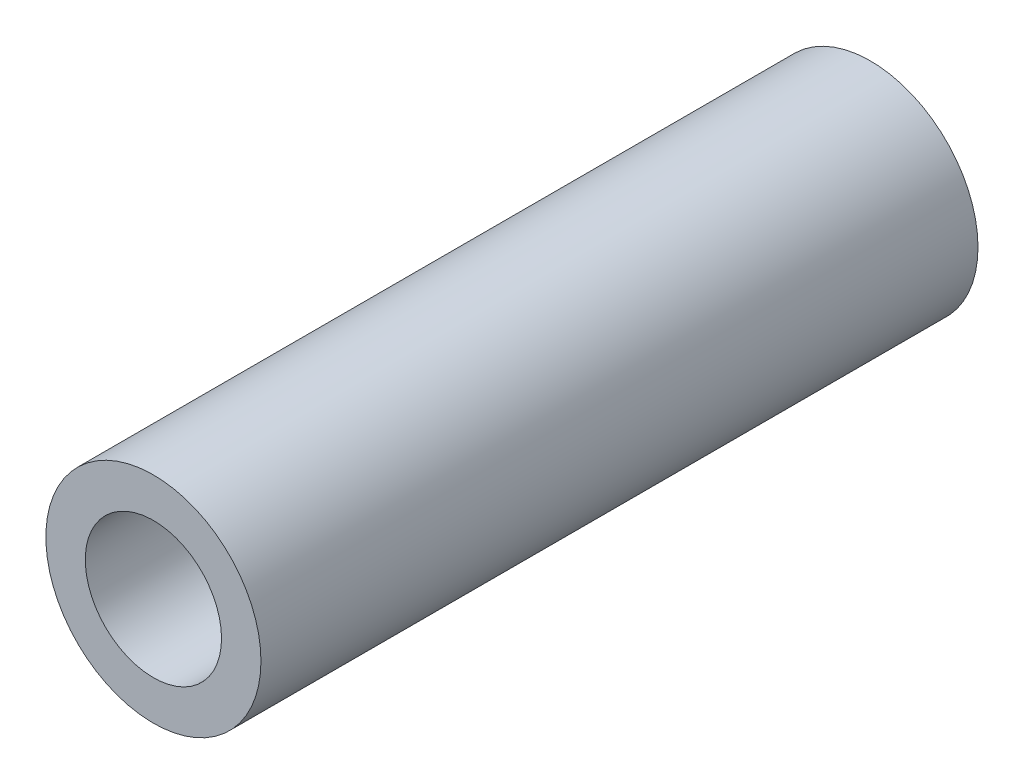
ISO-10303-21;
HEADER;
FILE_DESCRIPTION(('STEP AP214'),'2;1');
FILE_NAME('part.step','',(''),(''),'','','');
FILE_SCHEMA(('AUTOMOTIVE_DESIGN { 1 0 10303 214 1 1 1 1 }'));
ENDSEC;
DATA;
#1=APPLICATION_CONTEXT('core data for automotive mechanical design processes');
#2=APPLICATION_PROTOCOL_DEFINITION('international standard','automotive_design',2000,#1);
#3=PRODUCT_CONTEXT('',#1,'mechanical');
#4=PRODUCT('Part','Part','',(#3));
#5=PRODUCT_RELATED_PRODUCT_CATEGORY('part','',(#4));
#6=PRODUCT_DEFINITION_FORMATION('','',#4);
#7=PRODUCT_DEFINITION_CONTEXT('part definition',#1,'design');
#8=PRODUCT_DEFINITION('design','',#6,#7);
#9=PRODUCT_DEFINITION_SHAPE('','',#8);
#10=(LENGTH_UNIT() NAMED_UNIT(*) SI_UNIT(.MILLI.,.METRE.));
#11=(NAMED_UNIT(*) PLANE_ANGLE_UNIT() SI_UNIT($,.RADIAN.));
#12=(NAMED_UNIT(*) SI_UNIT($,.STERADIAN.) SOLID_ANGLE_UNIT());
#13=UNCERTAINTY_MEASURE_WITH_UNIT(LENGTH_MEASURE(1.E-05),#10,'distance_accuracy_value','');
#14=(GEOMETRIC_REPRESENTATION_CONTEXT(3) GLOBAL_UNCERTAINTY_ASSIGNED_CONTEXT((#13)) GLOBAL_UNIT_ASSIGNED_CONTEXT((#10,
#11,#12)) REPRESENTATION_CONTEXT('',''));
#15=CARTESIAN_POINT('',(0.,0.,0.));
#16=DIRECTION('',(0.,0.,1.));
#17=DIRECTION('',(1.,0.,0.));
#18=AXIS2_PLACEMENT_3D('',#15,#16,#17);
#19=CARTESIAN_POINT('',(0.,0.,50.8));
#20=DIRECTION('',(0.,0.,1.));
#21=DIRECTION('',(1.,0.,0.));
#22=AXIS2_PLACEMENT_3D('',#19,#20,#21);
#23=PLANE('',#22);
#24=CARTESIAN_POINT('',(0.,0.,50.8));
#25=DIRECTION('',(0.,0.,1.));
#26=DIRECTION('',(1.,0.,0.));
#27=AXIS2_PLACEMENT_3D('',#24,#25,#26);
#28=CIRCLE('',#27,7.62);
#29=CARTESIAN_POINT('',(7.62,0.,50.8));
#30=VERTEX_POINT('',#29);
#31=EDGE_CURVE('E10',#30,#30,#28,.T.);
#32=ORIENTED_EDGE('',*,*,#31,.T.);
#33=EDGE_LOOP('',(#32));
#34=FACE_BOUND('',#33,.T.);
#35=CARTESIAN_POINT('',(0.,0.,50.8));
#36=DIRECTION('',(0.,0.,1.));
#37=DIRECTION('',(1.,0.,0.));
#38=AXIS2_PLACEMENT_3D('',#35,#36,#37);
#39=CIRCLE('',#38,4.826);
#40=CARTESIAN_POINT('',(4.826,0.,50.8));
#41=VERTEX_POINT('',#40);
#42=EDGE_CURVE('E42',#41,#41,#39,.T.);
#43=ORIENTED_EDGE('',*,*,#42,.F.);
#44=EDGE_LOOP('',(#43));
#45=FACE_BOUND('',#44,.T.);
#46=ADVANCED_FACE('F31',(#34,#45),#23,.T.);
#47=CARTESIAN_POINT('',(0.,0.,0.));
#48=DIRECTION('',(0.,0.,1.));
#49=DIRECTION('',(1.,0.,0.));
#50=AXIS2_PLACEMENT_3D('',#47,#48,#49);
#51=PLANE('',#50);
#52=CARTESIAN_POINT('',(0.,0.,0.));
#53=DIRECTION('',(0.,0.,1.));
#54=DIRECTION('',(1.,0.,0.));
#55=AXIS2_PLACEMENT_3D('',#52,#53,#54);
#56=CIRCLE('',#55,7.62);
#57=CARTESIAN_POINT('',(7.62,0.,0.));
#58=VERTEX_POINT('',#57);
#59=EDGE_CURVE('E35',#58,#58,#56,.T.);
#60=ORIENTED_EDGE('',*,*,#59,.F.);
#61=EDGE_LOOP('',(#60));
#62=FACE_BOUND('',#61,.T.);
#63=CARTESIAN_POINT('',(0.,0.,0.));
#64=DIRECTION('',(0.,0.,1.));
#65=DIRECTION('',(1.,0.,0.));
#66=AXIS2_PLACEMENT_3D('',#63,#64,#65);
#67=CIRCLE('',#66,4.826);
#68=CARTESIAN_POINT('',(4.826,0.,0.));
#69=VERTEX_POINT('',#68);
#70=EDGE_CURVE('E44',#69,#69,#67,.T.);
#71=ORIENTED_EDGE('',*,*,#70,.T.);
#72=EDGE_LOOP('',(#71));
#73=FACE_BOUND('',#72,.T.);
#74=ADVANCED_FACE('F54',(#62,#73),#51,.F.);
#75=CARTESIAN_POINT('',(0.,0.,50.8));
#76=DIRECTION('',(0.,0.,-1.));
#77=DIRECTION('',(-1.,0.,0.));
#78=AXIS2_PLACEMENT_3D('',#75,#76,#77);
#79=CYLINDRICAL_SURFACE('',#78,7.62);
#80=ORIENTED_EDGE('',*,*,#31,.F.);
#81=EDGE_LOOP('',(#80));
#82=FACE_BOUND('',#81,.T.);
#83=ORIENTED_EDGE('',*,*,#59,.T.);
#84=EDGE_LOOP('',(#83));
#85=FACE_BOUND('',#84,.T.);
#86=ADVANCED_FACE('F33',(#82,#85),#79,.T.);
#87=CARTESIAN_POINT('',(0.,0.,50.8));
#88=DIRECTION('',(0.,0.,-1.));
#89=DIRECTION('',(-1.,0.,0.));
#90=AXIS2_PLACEMENT_3D('',#87,#88,#89);
#91=CYLINDRICAL_SURFACE('',#90,4.826);
#92=ORIENTED_EDGE('',*,*,#42,.T.);
#93=EDGE_LOOP('',(#92));
#94=FACE_BOUND('',#93,.T.);
#95=ORIENTED_EDGE('',*,*,#70,.F.);
#96=EDGE_LOOP('',(#95));
#97=FACE_BOUND('',#96,.T.);
#98=ADVANCED_FACE('F50',(#94,#97),#91,.F.);
#99=CLOSED_SHELL('',(#46,#74,#86,#98));
#100=MANIFOLD_SOLID_BREP('B2',#99);
#101=ADVANCED_BREP_SHAPE_REPRESENTATION('',(#18,#100),#14);
#102=SHAPE_DEFINITION_REPRESENTATION(#9,#101);
ENDSEC;
END-ISO-10303-21;
